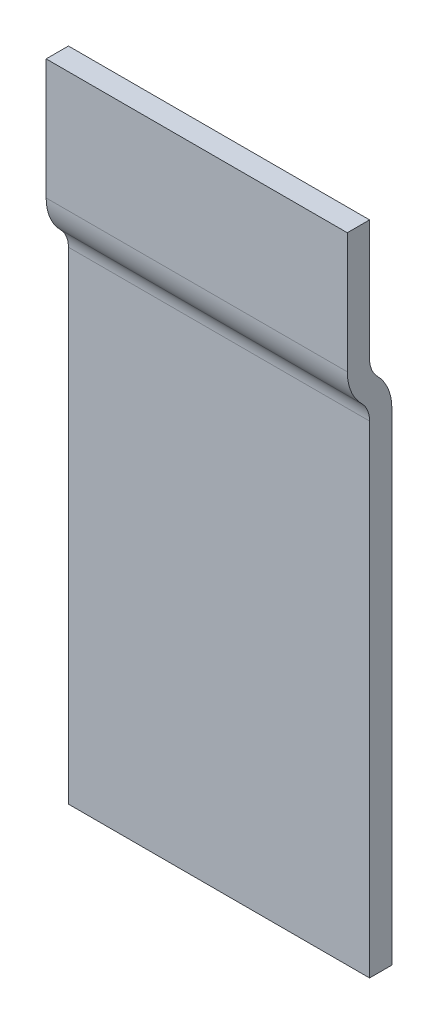
ISO-10303-21;
HEADER;
FILE_DESCRIPTION(('STEP AP214'),'2;1');
FILE_NAME('part.step','',(''),(''),'','','');
FILE_SCHEMA(('AUTOMOTIVE_DESIGN { 1 0 10303 214 1 1 1 1 }'));
ENDSEC;
DATA;
#1=APPLICATION_CONTEXT('core data for automotive mechanical design processes');
#2=APPLICATION_PROTOCOL_DEFINITION('international standard','automotive_design',2000,#1);
#3=PRODUCT_CONTEXT('',#1,'mechanical');
#4=PRODUCT('Part','Part','',(#3));
#5=PRODUCT_RELATED_PRODUCT_CATEGORY('part','',(#4));
#6=PRODUCT_DEFINITION_FORMATION('','',#4);
#7=PRODUCT_DEFINITION_CONTEXT('part definition',#1,'design');
#8=PRODUCT_DEFINITION('design','',#6,#7);
#9=PRODUCT_DEFINITION_SHAPE('','',#8);
#10=(LENGTH_UNIT() NAMED_UNIT(*) SI_UNIT(.MILLI.,.METRE.));
#11=(NAMED_UNIT(*) PLANE_ANGLE_UNIT() SI_UNIT($,.RADIAN.));
#12=(NAMED_UNIT(*) SI_UNIT($,.STERADIAN.) SOLID_ANGLE_UNIT());
#13=UNCERTAINTY_MEASURE_WITH_UNIT(LENGTH_MEASURE(1.E-05),#10,'distance_accuracy_value','');
#14=(GEOMETRIC_REPRESENTATION_CONTEXT(3) GLOBAL_UNCERTAINTY_ASSIGNED_CONTEXT((#13)) GLOBAL_UNIT_ASSIGNED_CONTEXT((#10,
#11,#12)) REPRESENTATION_CONTEXT('',''));
#15=CARTESIAN_POINT('',(0.,0.,0.));
#16=DIRECTION('',(0.,0.,1.));
#17=DIRECTION('',(1.,0.,0.));
#18=AXIS2_PLACEMENT_3D('',#15,#16,#17);
#19=CARTESIAN_POINT('',(-2.5,-0.0989022946157217,0.370000000000001));
#20=DIRECTION('',(0.,0.,1.));
#21=DIRECTION('',(1.,0.,0.));
#22=AXIS2_PLACEMENT_3D('',#19,#20,#21);
#23=PLANE('',#22);
#24=DIRECTION('',(0.,-1.,0.));
#25=VECTOR('',#24,1.);
#26=CARTESIAN_POINT('',(2.5,-0.0989022946157217,0.370000000000001));
#27=LINE('',#26,#25);
#28=CARTESIAN_POINT('',(2.5,10.9010977053843,0.370000000000002));
#29=VERTEX_POINT('',#28);
#30=CARTESIAN_POINT('',(2.5,8.90109770538426,0.370000000000001));
#31=VERTEX_POINT('',#30);
#32=EDGE_CURVE('E13',#29,#31,#27,.T.);
#33=ORIENTED_EDGE('',*,*,#32,.T.);
#34=DIRECTION('',(-1.,0.,0.));
#35=VECTOR('',#34,1.);
#36=CARTESIAN_POINT('',(-2.5,8.90109770538426,0.370000000000001));
#37=LINE('',#36,#35);
#38=CARTESIAN_POINT('',(-2.5,8.90109770538426,0.370000000000001));
#39=VERTEX_POINT('',#38);
#40=EDGE_CURVE('E159',#31,#39,#37,.T.);
#41=ORIENTED_EDGE('',*,*,#40,.T.);
#42=DIRECTION('',(0.,-1.,0.));
#43=VECTOR('',#42,1.);
#44=CARTESIAN_POINT('',(-2.5,-0.0989022946157217,0.370000000000001));
#45=LINE('',#44,#43);
#46=CARTESIAN_POINT('',(-2.5,10.9010977053843,0.370000000000002));
#47=VERTEX_POINT('',#46);
#48=EDGE_CURVE('E299',#47,#39,#45,.T.);
#49=ORIENTED_EDGE('',*,*,#48,.F.);
#50=DIRECTION('',(1.,0.,0.));
#51=VECTOR('',#50,1.);
#52=CARTESIAN_POINT('',(-2.5,10.9010977053843,0.370000000000001));
#53=LINE('',#52,#51);
#54=EDGE_CURVE('E319',#47,#29,#53,.T.);
#55=ORIENTED_EDGE('',*,*,#54,.T.);
#56=EDGE_LOOP('',(#33,#41,#49,#55));
#57=FACE_BOUND('',#56,.T.);
#58=ADVANCED_FACE('F149',(#57),#23,.F.);
#59=CARTESIAN_POINT('',(-2.5,-0.0989022946157217,0.740000000000001));
#60=DIRECTION('',(0.,0.,-1.));
#61=DIRECTION('',(-1.,0.,0.));
#62=AXIS2_PLACEMENT_3D('',#59,#60,#61);
#63=PLANE('',#62);
#64=DIRECTION('',(0.,1.,0.));
#65=VECTOR('',#64,1.);
#66=CARTESIAN_POINT('',(-2.5,-0.0989022946157217,0.740000000000001));
#67=LINE('',#66,#65);
#68=CARTESIAN_POINT('',(-2.5,8.90109770538425,0.740000000000002));
#69=VERTEX_POINT('',#68);
#70=CARTESIAN_POINT('',(-2.5,10.9010977053843,0.740000000000002));
#71=VERTEX_POINT('',#70);
#72=EDGE_CURVE('E296',#69,#71,#67,.T.);
#73=ORIENTED_EDGE('',*,*,#72,.F.);
#74=DIRECTION('',(1.,0.,0.));
#75=VECTOR('',#74,1.);
#76=CARTESIAN_POINT('',(-2.5,8.90109770538425,0.740000000000002));
#77=LINE('',#76,#75);
#78=CARTESIAN_POINT('',(2.5,8.90109770538425,0.740000000000002));
#79=VERTEX_POINT('',#78);
#80=EDGE_CURVE('E321',#69,#79,#77,.T.);
#81=ORIENTED_EDGE('',*,*,#80,.T.);
#82=DIRECTION('',(0.,1.,0.));
#83=VECTOR('',#82,1.);
#84=CARTESIAN_POINT('',(2.5,-0.0989022946157217,0.740000000000001));
#85=LINE('',#84,#83);
#86=CARTESIAN_POINT('',(2.5,10.9010977053843,0.740000000000002));
#87=VERTEX_POINT('',#86);
#88=EDGE_CURVE('E305',#79,#87,#85,.T.);
#89=ORIENTED_EDGE('',*,*,#88,.T.);
#90=DIRECTION('',(1.,0.,0.));
#91=VECTOR('',#90,1.);
#92=CARTESIAN_POINT('',(-2.5,10.9010977053843,0.740000000000002));
#93=LINE('',#92,#91);
#94=EDGE_CURVE('E277',#71,#87,#93,.T.);
#95=ORIENTED_EDGE('',*,*,#94,.F.);
#96=EDGE_LOOP('',(#73,#81,#89,#95));
#97=FACE_BOUND('',#96,.T.);
#98=ADVANCED_FACE('F348',(#97),#63,.F.);
#99=CARTESIAN_POINT('',(-2.5,13.489969823921,6.27158228392268));
#100=DIRECTION('',(1.,0.,0.));
#101=DIRECTION('',(0.,-0.707106781186549,-0.707106781186546));
#102=AXIS2_PLACEMENT_3D('',#99,#100,#101);
#103=PLANE('',#102);
#104=ORIENTED_EDGE('',*,*,#48,.T.);
#105=CARTESIAN_POINT('',(-2.5,8.90109770538426,-0.0766295090390438));
#106=DIRECTION('',(1.,0.,0.));
#107=DIRECTION('',(0.,0.,-1.));
#108=AXIS2_PLACEMENT_3D('',#105,#106,#107);
#109=CIRCLE('',#108,0.446629509039046);
#110=CARTESIAN_POINT('',(-2.5,8.58528295086474,0.239185245480494));
#111=VERTEX_POINT('',#110);
#112=EDGE_CURVE('E240',#39,#111,#109,.T.);
#113=ORIENTED_EDGE('',*,*,#112,.T.);
#114=CARTESIAN_POINT('',(-2.5,8.00783868730619,0.816629509039055));
#115=DIRECTION('',(-1.,0.,0.));
#116=DIRECTION('',(0.,0.,-1.));
#117=AXIS2_PLACEMENT_3D('',#114,#115,#116);
#118=CIRCLE('',#117,0.816629509039055);
#119=CARTESIAN_POINT('',(-2.5,8.00783868730619,0.));
#120=VERTEX_POINT('',#119);
#121=EDGE_CURVE('E234',#111,#120,#118,.T.);
#122=ORIENTED_EDGE('',*,*,#121,.T.);
#123=DIRECTION('',(0.,-1.,0.));
#124=VECTOR('',#123,1.);
#125=CARTESIAN_POINT('',(-2.5,0.,0.));
#126=LINE('',#125,#124);
#127=CARTESIAN_POINT('',(-2.5,0.,0.));
#128=VERTEX_POINT('',#127);
#129=EDGE_CURVE('E223',#120,#128,#126,.T.);
#130=ORIENTED_EDGE('',*,*,#129,.T.);
#131=DIRECTION('',(0.,0.,1.));
#132=VECTOR('',#131,1.);
#133=CARTESIAN_POINT('',(-2.5,0.,0.37));
#134=LINE('',#133,#132);
#135=CARTESIAN_POINT('',(-2.5,0.,0.37));
#136=VERTEX_POINT('',#135);
#137=EDGE_CURVE('E235',#128,#136,#134,.T.);
#138=ORIENTED_EDGE('',*,*,#137,.T.);
#139=DIRECTION('',(0.,1.,0.));
#140=VECTOR('',#139,1.);
#141=CARTESIAN_POINT('',(-2.5,0.,0.37));
#142=LINE('',#141,#140);
#143=CARTESIAN_POINT('',(-2.5,8.00783868730619,0.37));
#144=VERTEX_POINT('',#143);
#145=EDGE_CURVE('E324',#136,#144,#142,.T.);
#146=ORIENTED_EDGE('',*,*,#145,.T.);
#147=CARTESIAN_POINT('',(-2.5,8.00783868730619,0.816629509039055));
#148=DIRECTION('',(1.,0.,0.));
#149=DIRECTION('',(0.,0.,-1.));
#150=AXIS2_PLACEMENT_3D('',#147,#148,#149);
#151=CIRCLE('',#150,0.446629509039055);
#152=CARTESIAN_POINT('',(-2.5,8.32365344182572,0.500814754519519));
#153=VERTEX_POINT('',#152);
#154=EDGE_CURVE('E313',#144,#153,#151,.T.);
#155=ORIENTED_EDGE('',*,*,#154,.T.);
#156=CARTESIAN_POINT('',(-2.5,8.90109770538426,-0.0766295090390438));
#157=DIRECTION('',(1.,0.,0.));
#158=DIRECTION('',(0.,0.,-1.));
#159=AXIS2_PLACEMENT_3D('',#156,#157,#158);
#160=CIRCLE('',#159,0.816629509039046);
#161=EDGE_CURVE('E243',#153,#69,#160,.F.);
#162=ORIENTED_EDGE('',*,*,#161,.T.);
#163=ORIENTED_EDGE('',*,*,#72,.T.);
#164=DIRECTION('',(0.,0.,-1.));
#165=VECTOR('',#164,1.);
#166=CARTESIAN_POINT('',(-2.5,10.9010977053843,0.740000000000002));
#167=LINE('',#166,#165);
#168=EDGE_CURVE('E300',#71,#47,#167,.T.);
#169=ORIENTED_EDGE('',*,*,#168,.T.);
#170=EDGE_LOOP('',(#104,#113,#122,#130,#138,#146,#155,#162,#163,#169));
#171=FACE_BOUND('',#170,.T.);
#172=ADVANCED_FACE('F239',(#171),#103,.F.);
#173=CARTESIAN_POINT('',(2.5,-0.0989022946157217,0.370000000000001));
#174=DIRECTION('',(-1.,0.,0.));
#175=DIRECTION('',(0.,0.,1.));
#176=AXIS2_PLACEMENT_3D('',#173,#174,#175);
#177=PLANE('',#176);
#178=ORIENTED_EDGE('',*,*,#88,.F.);
#179=CARTESIAN_POINT('',(2.5,8.90109770538426,-0.0766295090390438));
#180=DIRECTION('',(1.,0.,0.));
#181=DIRECTION('',(0.,0.,-1.));
#182=AXIS2_PLACEMENT_3D('',#179,#180,#181);
#183=CIRCLE('',#182,0.816629509039046);
#184=CARTESIAN_POINT('',(2.5,8.32365344182572,0.500814754519519));
#185=VERTEX_POINT('',#184);
#186=EDGE_CURVE('E307',#185,#79,#183,.F.);
#187=ORIENTED_EDGE('',*,*,#186,.F.);
#188=CARTESIAN_POINT('',(2.5,8.00783868730619,0.816629509039055));
#189=DIRECTION('',(1.,0.,0.));
#190=DIRECTION('',(0.,0.,-1.));
#191=AXIS2_PLACEMENT_3D('',#188,#189,#190);
#192=CIRCLE('',#191,0.446629509039055);
#193=CARTESIAN_POINT('',(2.5,8.00783868730619,0.37));
#194=VERTEX_POINT('',#193);
#195=EDGE_CURVE('E254',#194,#185,#192,.T.);
#196=ORIENTED_EDGE('',*,*,#195,.F.);
#197=DIRECTION('',(0.,1.,0.));
#198=VECTOR('',#197,1.);
#199=CARTESIAN_POINT('',(2.5,0.,0.37));
#200=LINE('',#199,#198);
#201=CARTESIAN_POINT('',(2.5,0.,0.37));
#202=VERTEX_POINT('',#201);
#203=EDGE_CURVE('E267',#202,#194,#200,.T.);
#204=ORIENTED_EDGE('',*,*,#203,.F.);
#205=DIRECTION('',(0.,0.,1.));
#206=VECTOR('',#205,1.);
#207=CARTESIAN_POINT('',(2.5,0.,0.37));
#208=LINE('',#207,#206);
#209=CARTESIAN_POINT('',(2.5,0.,0.));
#210=VERTEX_POINT('',#209);
#211=EDGE_CURVE('E286',#210,#202,#208,.T.);
#212=ORIENTED_EDGE('',*,*,#211,.F.);
#213=DIRECTION('',(0.,-1.,0.));
#214=VECTOR('',#213,1.);
#215=CARTESIAN_POINT('',(2.5,0.,0.));
#216=LINE('',#215,#214);
#217=CARTESIAN_POINT('',(2.5,8.00783868730619,0.));
#218=VERTEX_POINT('',#217);
#219=EDGE_CURVE('E282',#218,#210,#216,.T.);
#220=ORIENTED_EDGE('',*,*,#219,.F.);
#221=CARTESIAN_POINT('',(2.5,8.00783868730619,0.816629509039055));
#222=DIRECTION('',(-1.,0.,0.));
#223=DIRECTION('',(0.,0.,-1.));
#224=AXIS2_PLACEMENT_3D('',#221,#222,#223);
#225=CIRCLE('',#224,0.816629509039055);
#226=CARTESIAN_POINT('',(2.5,8.58528295086474,0.239185245480494));
#227=VERTEX_POINT('',#226);
#228=EDGE_CURVE('E247',#227,#218,#225,.T.);
#229=ORIENTED_EDGE('',*,*,#228,.F.);
#230=CARTESIAN_POINT('',(2.5,8.90109770538426,-0.0766295090390438));
#231=DIRECTION('',(1.,0.,0.));
#232=DIRECTION('',(0.,0.,-1.));
#233=AXIS2_PLACEMENT_3D('',#230,#231,#232);
#234=CIRCLE('',#233,0.446629509039046);
#235=EDGE_CURVE('E153',#31,#227,#234,.T.);
#236=ORIENTED_EDGE('',*,*,#235,.F.);
#237=ORIENTED_EDGE('',*,*,#32,.F.);
#238=DIRECTION('',(0.,0.,-1.));
#239=VECTOR('',#238,1.);
#240=CARTESIAN_POINT('',(2.5,10.9010977053843,0.740000000000002));
#241=LINE('',#240,#239);
#242=EDGE_CURVE('E272',#87,#29,#241,.T.);
#243=ORIENTED_EDGE('',*,*,#242,.F.);
#244=EDGE_LOOP('',(#178,#187,#196,#204,#212,#220,#229,#236,#237,#243));
#245=FACE_BOUND('',#244,.T.);
#246=ADVANCED_FACE('F350',(#245),#177,.F.);
#247=CARTESIAN_POINT('',(-2.50000000050932,8.90109770538426,-0.0766295090390438));
#248=DIRECTION('',(1.,0.,0.));
#249=DIRECTION('',(0.,0.707106781186546,0.70710678118655));
#250=AXIS2_PLACEMENT_3D('',#247,#248,#249);
#251=CYLINDRICAL_SURFACE('',#250,0.816629509039046);
#252=ORIENTED_EDGE('',*,*,#80,.F.);
#253=ORIENTED_EDGE('',*,*,#161,.F.);
#254=DIRECTION('',(1.,0.,0.));
#255=VECTOR('',#254,1.);
#256=CARTESIAN_POINT('',(-2.5,8.32365344182572,0.500814754519522));
#257=LINE('',#256,#255);
#258=EDGE_CURVE('E308',#153,#185,#257,.T.);
#259=ORIENTED_EDGE('',*,*,#258,.T.);
#260=ORIENTED_EDGE('',*,*,#186,.T.);
#261=EDGE_LOOP('',(#252,#253,#259,#260));
#262=FACE_BOUND('',#261,.T.);
#263=ADVANCED_FACE('F357',(#262),#251,.T.);
#264=CARTESIAN_POINT('',(-2.50000000050932,8.90109770538426,-0.0766295090390438));
#265=DIRECTION('',(1.,0.,0.));
#266=DIRECTION('',(0.,0.707106781186546,0.70710678118655));
#267=AXIS2_PLACEMENT_3D('',#264,#265,#266);
#268=CYLINDRICAL_SURFACE('',#267,0.446629509039046);
#269=ORIENTED_EDGE('',*,*,#40,.F.);
#270=ORIENTED_EDGE('',*,*,#235,.T.);
#271=DIRECTION('',(-1.,0.,0.));
#272=VECTOR('',#271,1.);
#273=CARTESIAN_POINT('',(-2.5,8.58528295086474,0.2391852454805));
#274=LINE('',#273,#272);
#275=EDGE_CURVE('E251',#227,#111,#274,.T.);
#276=ORIENTED_EDGE('',*,*,#275,.T.);
#277=ORIENTED_EDGE('',*,*,#112,.F.);
#278=EDGE_LOOP('',(#269,#270,#276,#277));
#279=FACE_BOUND('',#278,.T.);
#280=ADVANCED_FACE('F359',(#279),#268,.F.);
#281=CARTESIAN_POINT('',(-2.50000000050932,8.00783868730619,0.816629509039055));
#282=DIRECTION('',(1.,0.,0.));
#283=DIRECTION('',(0.,1.,0.));
#284=AXIS2_PLACEMENT_3D('',#281,#282,#283);
#285=CYLINDRICAL_SURFACE('',#284,0.816629509039055);
#286=ORIENTED_EDGE('',*,*,#275,.F.);
#287=ORIENTED_EDGE('',*,*,#228,.T.);
#288=DIRECTION('',(-1.,0.,0.));
#289=VECTOR('',#288,1.);
#290=CARTESIAN_POINT('',(-2.5,8.00783868730619,0.));
#291=LINE('',#290,#289);
#292=EDGE_CURVE('E228',#218,#120,#291,.T.);
#293=ORIENTED_EDGE('',*,*,#292,.T.);
#294=ORIENTED_EDGE('',*,*,#121,.F.);
#295=EDGE_LOOP('',(#286,#287,#293,#294));
#296=FACE_BOUND('',#295,.T.);
#297=ADVANCED_FACE('F245',(#296),#285,.T.);
#298=CARTESIAN_POINT('',(-2.50000000050932,8.00783868730619,0.816629509039055));
#299=DIRECTION('',(1.,0.,0.));
#300=DIRECTION('',(0.,1.,0.));
#301=AXIS2_PLACEMENT_3D('',#298,#299,#300);
#302=CYLINDRICAL_SURFACE('',#301,0.446629509039055);
#303=ORIENTED_EDGE('',*,*,#258,.F.);
#304=ORIENTED_EDGE('',*,*,#154,.F.);
#305=DIRECTION('',(1.,0.,0.));
#306=VECTOR('',#305,1.);
#307=CARTESIAN_POINT('',(-2.5,8.00783868730619,0.37));
#308=LINE('',#307,#306);
#309=EDGE_CURVE('E249',#144,#194,#308,.T.);
#310=ORIENTED_EDGE('',*,*,#309,.T.);
#311=ORIENTED_EDGE('',*,*,#195,.T.);
#312=EDGE_LOOP('',(#303,#304,#310,#311));
#313=FACE_BOUND('',#312,.T.);
#314=ADVANCED_FACE('F339',(#313),#302,.F.);
#315=CARTESIAN_POINT('',(-2.5,0.,0.37));
#316=DIRECTION('',(0.,0.,-1.));
#317=DIRECTION('',(-1.,0.,0.));
#318=AXIS2_PLACEMENT_3D('',#315,#316,#317);
#319=PLANE('',#318);
#320=ORIENTED_EDGE('',*,*,#309,.F.);
#321=ORIENTED_EDGE('',*,*,#145,.F.);
#322=DIRECTION('',(1.,0.,0.));
#323=VECTOR('',#322,1.);
#324=CARTESIAN_POINT('',(-2.5,0.,0.37));
#325=LINE('',#324,#323);
#326=EDGE_CURVE('E264',#136,#202,#325,.T.);
#327=ORIENTED_EDGE('',*,*,#326,.T.);
#328=ORIENTED_EDGE('',*,*,#203,.T.);
#329=EDGE_LOOP('',(#320,#321,#327,#328));
#330=FACE_BOUND('',#329,.T.);
#331=ADVANCED_FACE('F337',(#330),#319,.F.);
#332=CARTESIAN_POINT('',(-2.5,10.9010977053843,0.740000000000002));
#333=DIRECTION('',(0.,-1.,0.));
#334=DIRECTION('',(0.,0.,-1.));
#335=AXIS2_PLACEMENT_3D('',#332,#333,#334);
#336=PLANE('',#335);
#337=ORIENTED_EDGE('',*,*,#242,.T.);
#338=ORIENTED_EDGE('',*,*,#54,.F.);
#339=ORIENTED_EDGE('',*,*,#168,.F.);
#340=ORIENTED_EDGE('',*,*,#94,.T.);
#341=EDGE_LOOP('',(#337,#338,#339,#340));
#342=FACE_BOUND('',#341,.T.);
#343=ADVANCED_FACE('F354',(#342),#336,.F.);
#344=CARTESIAN_POINT('',(-2.5,0.,0.));
#345=DIRECTION('',(0.,0.,1.));
#346=DIRECTION('',(1.,0.,0.));
#347=AXIS2_PLACEMENT_3D('',#344,#345,#346);
#348=PLANE('',#347);
#349=ORIENTED_EDGE('',*,*,#292,.F.);
#350=ORIENTED_EDGE('',*,*,#219,.T.);
#351=DIRECTION('',(1.,0.,0.));
#352=VECTOR('',#351,1.);
#353=CARTESIAN_POINT('',(-2.5,0.,0.));
#354=LINE('',#353,#352);
#355=EDGE_CURVE('E231',#128,#210,#354,.T.);
#356=ORIENTED_EDGE('',*,*,#355,.F.);
#357=ORIENTED_EDGE('',*,*,#129,.F.);
#358=EDGE_LOOP('',(#349,#350,#356,#357));
#359=FACE_BOUND('',#358,.T.);
#360=ADVANCED_FACE('F225',(#359),#348,.F.);
#361=CARTESIAN_POINT('',(-2.5,0.,0.37));
#362=DIRECTION('',(0.,1.,0.));
#363=DIRECTION('',(0.,0.,1.));
#364=AXIS2_PLACEMENT_3D('',#361,#362,#363);
#365=PLANE('',#364);
#366=ORIENTED_EDGE('',*,*,#211,.T.);
#367=ORIENTED_EDGE('',*,*,#326,.F.);
#368=ORIENTED_EDGE('',*,*,#137,.F.);
#369=ORIENTED_EDGE('',*,*,#355,.T.);
#370=EDGE_LOOP('',(#366,#367,#368,#369));
#371=FACE_BOUND('',#370,.T.);
#372=ADVANCED_FACE('F151',(#371),#365,.F.);
#373=CLOSED_SHELL('',(#58,#98,#172,#246,#263,#280,#297,#314,#331,#343,#360,#372));
#374=MANIFOLD_SOLID_BREP('B2',#373);
#375=ADVANCED_BREP_SHAPE_REPRESENTATION('',(#18,#374),#14);
#376=SHAPE_DEFINITION_REPRESENTATION(#9,#375);
ENDSEC;
END-ISO-10303-21;
